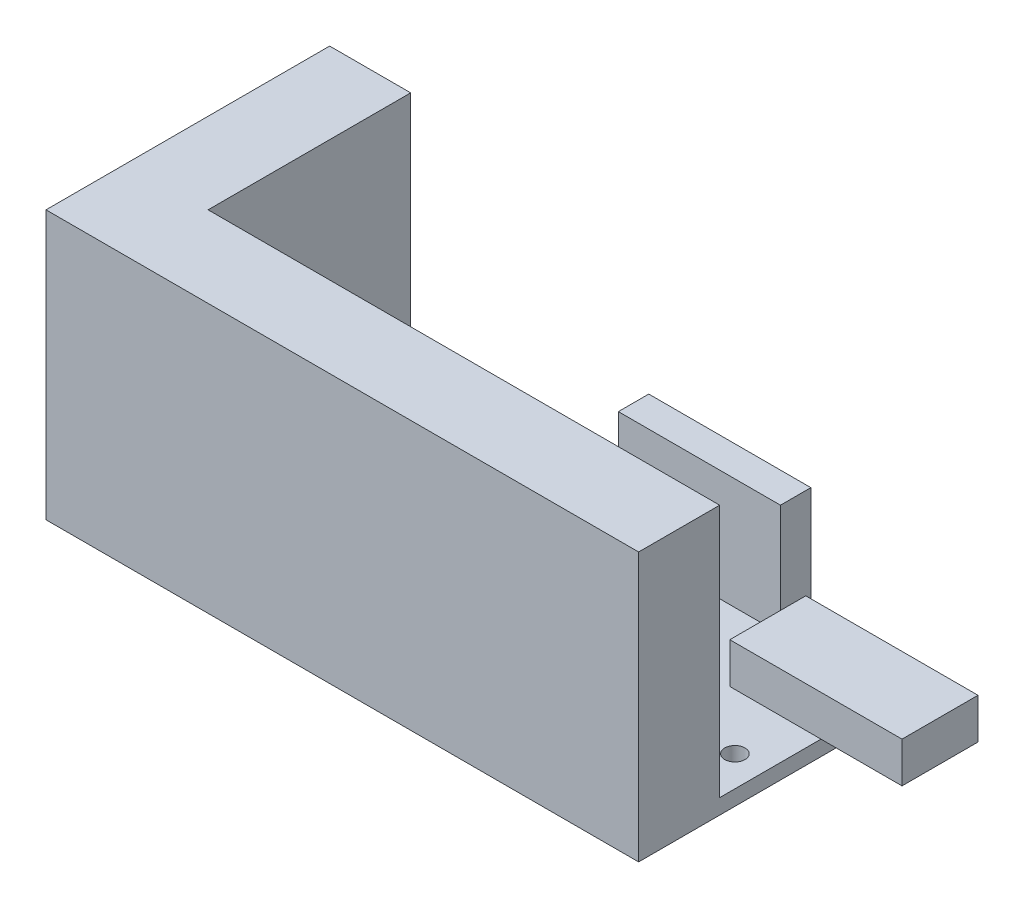
ISO-10303-21;
HEADER;
FILE_DESCRIPTION(('STEP AP214'),'2;1');
FILE_NAME('part.step','',(''),(''),'','','');
FILE_SCHEMA(('AUTOMOTIVE_DESIGN { 1 0 10303 214 1 1 1 1 }'));
ENDSEC;
DATA;
#1=APPLICATION_CONTEXT('core data for automotive mechanical design processes');
#2=APPLICATION_PROTOCOL_DEFINITION('international standard','automotive_design',2000,#1);
#3=PRODUCT_CONTEXT('',#1,'mechanical');
#4=PRODUCT('Part','Part','',(#3));
#5=PRODUCT_RELATED_PRODUCT_CATEGORY('part','',(#4));
#6=PRODUCT_DEFINITION_FORMATION('','',#4);
#7=PRODUCT_DEFINITION_CONTEXT('part definition',#1,'design');
#8=PRODUCT_DEFINITION('design','',#6,#7);
#9=PRODUCT_DEFINITION_SHAPE('','',#8);
#10=(LENGTH_UNIT() NAMED_UNIT(*) SI_UNIT(.MILLI.,.METRE.));
#11=(NAMED_UNIT(*) PLANE_ANGLE_UNIT() SI_UNIT($,.RADIAN.));
#12=(NAMED_UNIT(*) SI_UNIT($,.STERADIAN.) SOLID_ANGLE_UNIT());
#13=UNCERTAINTY_MEASURE_WITH_UNIT(LENGTH_MEASURE(1.E-05),#10,'distance_accuracy_value','');
#14=(GEOMETRIC_REPRESENTATION_CONTEXT(3) GLOBAL_UNCERTAINTY_ASSIGNED_CONTEXT((#13)) GLOBAL_UNIT_ASSIGNED_CONTEXT((#10,
#11,#12)) REPRESENTATION_CONTEXT('',''));
#15=CARTESIAN_POINT('',(0.,0.,0.));
#16=DIRECTION('',(0.,0.,1.));
#17=DIRECTION('',(1.,0.,0.));
#18=AXIS2_PLACEMENT_3D('',#15,#16,#17);
#19=CARTESIAN_POINT('',(0.,1.5,0.));
#20=DIRECTION('',(0.,-1.,0.));
#21=DIRECTION('',(0.,0.,-1.));
#22=AXIS2_PLACEMENT_3D('',#19,#20,#21);
#23=PLANE('',#22);
#24=DIRECTION('',(0.,0.,-1.));
#25=VECTOR('',#24,1.);
#26=CARTESIAN_POINT('',(0.,1.5,-28.));
#27=LINE('',#26,#25);
#28=CARTESIAN_POINT('',(0.,1.5,-8.));
#29=VERTEX_POINT('',#28);
#30=CARTESIAN_POINT('',(0.,1.5,-18.));
#31=VERTEX_POINT('',#30);
#32=EDGE_CURVE('E261',#29,#31,#27,.T.);
#33=ORIENTED_EDGE('',*,*,#32,.T.);
#34=DIRECTION('',(-1.,0.,0.));
#35=VECTOR('',#34,1.);
#36=CARTESIAN_POINT('',(0.,1.5,-18.));
#37=LINE('',#36,#35);
#38=CARTESIAN_POINT('',(-9.,1.5,-18.));
#39=VERTEX_POINT('',#38);
#40=EDGE_CURVE('E61',#31,#39,#37,.T.);
#41=ORIENTED_EDGE('',*,*,#40,.T.);
#42=DIRECTION('',(0.,0.,-1.));
#43=VECTOR('',#42,1.);
#44=CARTESIAN_POINT('',(-9.,1.5,0.));
#45=LINE('',#44,#43);
#46=CARTESIAN_POINT('',(-9.,1.5,-25.5));
#47=VERTEX_POINT('',#46);
#48=EDGE_CURVE('E56',#39,#47,#45,.T.);
#49=ORIENTED_EDGE('',*,*,#48,.T.);
#50=DIRECTION('',(1.,0.,0.));
#51=VECTOR('',#50,1.);
#52=CARTESIAN_POINT('',(0.,1.5,-25.5));
#53=LINE('',#52,#51);
#54=CARTESIAN_POINT('',(0.,1.5,-25.5));
#55=VERTEX_POINT('',#54);
#56=EDGE_CURVE('E190',#47,#55,#53,.T.);
#57=ORIENTED_EDGE('',*,*,#56,.T.);
#58=CARTESIAN_POINT('',(0.,1.5,-28.));
#59=VERTEX_POINT('',#58);
#60=EDGE_CURVE('E42',#55,#59,#27,.T.);
#61=ORIENTED_EDGE('',*,*,#60,.T.);
#62=DIRECTION('',(-1.,0.,0.));
#63=VECTOR('',#62,1.);
#64=CARTESIAN_POINT('',(-58.5,1.5,-28.));
#65=LINE('',#64,#63);
#66=CARTESIAN_POINT('',(-11.,1.5,-28.));
#67=VERTEX_POINT('',#66);
#68=EDGE_CURVE('E260',#59,#67,#65,.T.);
#69=ORIENTED_EDGE('',*,*,#68,.T.);
#70=DIRECTION('',(0.,0.,1.));
#71=VECTOR('',#70,1.);
#72=CARTESIAN_POINT('',(-11.,1.5,0.));
#73=LINE('',#72,#71);
#74=CARTESIAN_POINT('',(-11.,1.5,-25.));
#75=VERTEX_POINT('',#74);
#76=EDGE_CURVE('E201',#67,#75,#73,.T.);
#77=ORIENTED_EDGE('',*,*,#76,.T.);
#78=DIRECTION('',(-1.,0.,0.));
#79=VECTOR('',#78,1.);
#80=CARTESIAN_POINT('',(0.,1.5,-25.));
#81=LINE('',#80,#79);
#82=CARTESIAN_POINT('',(-27.,1.5,-25.));
#83=VERTEX_POINT('',#82);
#84=EDGE_CURVE('E212',#75,#83,#81,.T.);
#85=ORIENTED_EDGE('',*,*,#84,.T.);
#86=DIRECTION('',(0.,0.,-1.));
#87=VECTOR('',#86,1.);
#88=CARTESIAN_POINT('',(-27.,1.5,0.));
#89=LINE('',#88,#87);
#90=CARTESIAN_POINT('',(-27.,1.5,-28.));
#91=VERTEX_POINT('',#90);
#92=EDGE_CURVE('E166',#83,#91,#89,.T.);
#93=ORIENTED_EDGE('',*,*,#92,.T.);
#94=CARTESIAN_POINT('',(-50.5,1.5,-28.));
#95=VERTEX_POINT('',#94);
#96=EDGE_CURVE('E258',#91,#95,#65,.T.);
#97=ORIENTED_EDGE('',*,*,#96,.T.);
#98=DIRECTION('',(0.,0.,-1.));
#99=VECTOR('',#98,1.);
#100=CARTESIAN_POINT('',(-50.5,1.5,-28.));
#101=LINE('',#100,#99);
#102=CARTESIAN_POINT('',(-50.5,1.5,-8.));
#103=VERTEX_POINT('',#102);
#104=EDGE_CURVE('E231',#103,#95,#101,.T.);
#105=ORIENTED_EDGE('',*,*,#104,.F.);
#106=DIRECTION('',(-1.,0.,0.));
#107=VECTOR('',#106,1.);
#108=CARTESIAN_POINT('',(0.,1.5,-8.));
#109=LINE('',#108,#107);
#110=EDGE_CURVE('E226',#29,#103,#109,.T.);
#111=ORIENTED_EDGE('',*,*,#110,.F.);
#112=EDGE_LOOP('',(#33,#41,#49,#57,#61,#69,#77,#85,#93,#97,#105,#111));
#113=FACE_BOUND('',#112,.T.);
#114=CARTESIAN_POINT('',(-3.,1.5,-12.5));
#115=DIRECTION('',(0.,1.,0.));
#116=DIRECTION('',(0.,0.,1.));
#117=AXIS2_PLACEMENT_3D('',#114,#115,#116);
#118=CIRCLE('',#117,1.);
#119=CARTESIAN_POINT('',(-3.,1.5,-11.5));
#120=VERTEX_POINT('',#119);
#121=EDGE_CURVE('E328',#120,#120,#118,.T.);
#122=ORIENTED_EDGE('',*,*,#121,.F.);
#123=EDGE_LOOP('',(#122));
#124=FACE_BOUND('',#123,.T.);
#125=CARTESIAN_POINT('',(-41.5,1.5,-25.5));
#126=DIRECTION('',(0.,1.,0.));
#127=DIRECTION('',(0.,0.,1.));
#128=AXIS2_PLACEMENT_3D('',#125,#126,#127);
#129=CIRCLE('',#128,0.999999999999998);
#130=CARTESIAN_POINT('',(-41.5,1.5,-24.5));
#131=VERTEX_POINT('',#130);
#132=EDGE_CURVE('E279',#131,#131,#129,.T.);
#133=ORIENTED_EDGE('',*,*,#132,.F.);
#134=EDGE_LOOP('',(#133));
#135=FACE_BOUND('',#134,.T.);
#136=ADVANCED_FACE('F38',(#113,#124,#135),#23,.F.);
#137=CARTESIAN_POINT('',(0.,1.5,-28.));
#138=DIRECTION('',(-1.,0.,0.));
#139=DIRECTION('',(0.,0.,1.));
#140=AXIS2_PLACEMENT_3D('',#137,#138,#139);
#141=PLANE('',#140);
#142=DIRECTION('',(0.,0.,-1.));
#143=VECTOR('',#142,1.);
#144=CARTESIAN_POINT('',(0.,0.,-28.));
#145=LINE('',#144,#143);
#146=CARTESIAN_POINT('',(0.,0.,0.));
#147=VERTEX_POINT('',#146);
#148=CARTESIAN_POINT('',(0.,0.,-28.));
#149=VERTEX_POINT('',#148);
#150=EDGE_CURVE('E267',#147,#149,#145,.T.);
#151=ORIENTED_EDGE('',*,*,#150,.T.);
#152=DIRECTION('',(0.,-1.,0.));
#153=VECTOR('',#152,1.);
#154=CARTESIAN_POINT('',(0.,1.5,-28.));
#155=LINE('',#154,#153);
#156=EDGE_CURVE('E11',#59,#149,#155,.T.);
#157=ORIENTED_EDGE('',*,*,#156,.F.);
#158=ORIENTED_EDGE('',*,*,#60,.F.);
#159=EDGE_CURVE('E262',#31,#55,#27,.T.);
#160=ORIENTED_EDGE('',*,*,#159,.F.);
#161=ORIENTED_EDGE('',*,*,#32,.F.);
#162=DIRECTION('',(0.,-1.,0.));
#163=VECTOR('',#162,1.);
#164=CARTESIAN_POINT('',(0.,26.5,-8.));
#165=LINE('',#164,#163);
#166=CARTESIAN_POINT('',(0.,26.5,-8.));
#167=VERTEX_POINT('',#166);
#168=EDGE_CURVE('E277',#167,#29,#165,.T.);
#169=ORIENTED_EDGE('',*,*,#168,.F.);
#170=DIRECTION('',(0.,0.,-1.));
#171=VECTOR('',#170,1.);
#172=CARTESIAN_POINT('',(0.,26.5,0.));
#173=LINE('',#172,#171);
#174=CARTESIAN_POINT('',(0.,26.5,0.));
#175=VERTEX_POINT('',#174);
#176=EDGE_CURVE('E230',#175,#167,#173,.T.);
#177=ORIENTED_EDGE('',*,*,#176,.F.);
#178=DIRECTION('',(0.,-1.,0.));
#179=VECTOR('',#178,1.);
#180=CARTESIAN_POINT('',(0.,1.5,0.));
#181=LINE('',#180,#179);
#182=EDGE_CURVE('E273',#175,#147,#181,.T.);
#183=ORIENTED_EDGE('',*,*,#182,.T.);
#184=EDGE_LOOP('',(#151,#157,#158,#160,#161,#169,#177,#183));
#185=FACE_BOUND('',#184,.T.);
#186=ADVANCED_FACE('F40',(#185),#141,.F.);
#187=CARTESIAN_POINT('',(-58.5,1.5,-28.));
#188=DIRECTION('',(0.,0.,1.));
#189=DIRECTION('',(1.,0.,0.));
#190=AXIS2_PLACEMENT_3D('',#187,#188,#189);
#191=PLANE('',#190);
#192=DIRECTION('',(-1.,0.,0.));
#193=VECTOR('',#192,1.);
#194=CARTESIAN_POINT('',(-58.5,0.,-28.));
#195=LINE('',#194,#193);
#196=CARTESIAN_POINT('',(-58.5,0.,-28.));
#197=VERTEX_POINT('',#196);
#198=EDGE_CURVE('E309',#149,#197,#195,.T.);
#199=ORIENTED_EDGE('',*,*,#198,.T.);
#200=DIRECTION('',(0.,-1.,0.));
#201=VECTOR('',#200,1.);
#202=CARTESIAN_POINT('',(-58.5,1.5,-28.));
#203=LINE('',#202,#201);
#204=CARTESIAN_POINT('',(-58.5,26.5,-28.));
#205=VERTEX_POINT('',#204);
#206=EDGE_CURVE('E48',#205,#197,#203,.T.);
#207=ORIENTED_EDGE('',*,*,#206,.F.);
#208=DIRECTION('',(-1.,0.,0.));
#209=VECTOR('',#208,1.);
#210=CARTESIAN_POINT('',(-58.5,26.5,-28.));
#211=LINE('',#210,#209);
#212=CARTESIAN_POINT('',(-50.5,26.5,-28.));
#213=VERTEX_POINT('',#212);
#214=EDGE_CURVE('E237',#213,#205,#211,.T.);
#215=ORIENTED_EDGE('',*,*,#214,.F.);
#216=DIRECTION('',(0.,-1.,0.));
#217=VECTOR('',#216,1.);
#218=CARTESIAN_POINT('',(-50.5,26.5,-28.));
#219=LINE('',#218,#217);
#220=EDGE_CURVE('E243',#213,#95,#219,.T.);
#221=ORIENTED_EDGE('',*,*,#220,.T.);
#222=ORIENTED_EDGE('',*,*,#96,.F.);
#223=DIRECTION('',(0.,-1.,0.));
#224=VECTOR('',#223,1.);
#225=CARTESIAN_POINT('',(-27.,12.5,-28.));
#226=LINE('',#225,#224);
#227=CARTESIAN_POINT('',(-27.,12.5,-28.));
#228=VERTEX_POINT('',#227);
#229=EDGE_CURVE('E209',#228,#91,#226,.T.);
#230=ORIENTED_EDGE('',*,*,#229,.F.);
#231=DIRECTION('',(-1.,0.,0.));
#232=VECTOR('',#231,1.);
#233=CARTESIAN_POINT('',(0.,12.5,-28.));
#234=LINE('',#233,#232);
#235=CARTESIAN_POINT('',(-11.,12.5,-28.));
#236=VERTEX_POINT('',#235);
#237=EDGE_CURVE('E207',#236,#228,#234,.T.);
#238=ORIENTED_EDGE('',*,*,#237,.F.);
#239=DIRECTION('',(0.,-1.,0.));
#240=VECTOR('',#239,1.);
#241=CARTESIAN_POINT('',(-11.,12.5,-28.));
#242=LINE('',#241,#240);
#243=EDGE_CURVE('E217',#236,#67,#242,.T.);
#244=ORIENTED_EDGE('',*,*,#243,.T.);
#245=ORIENTED_EDGE('',*,*,#68,.F.);
#246=ORIENTED_EDGE('',*,*,#156,.T.);
#247=EDGE_LOOP('',(#199,#207,#215,#221,#222,#230,#238,#244,#245,#246));
#248=FACE_BOUND('',#247,.T.);
#249=ADVANCED_FACE('F349',(#248),#191,.F.);
#250=CARTESIAN_POINT('',(-58.5,1.5,0.));
#251=DIRECTION('',(1.,0.,0.));
#252=DIRECTION('',(0.,0.,-1.));
#253=AXIS2_PLACEMENT_3D('',#250,#251,#252);
#254=PLANE('',#253);
#255=DIRECTION('',(0.,0.,1.));
#256=VECTOR('',#255,1.);
#257=CARTESIAN_POINT('',(-58.5,0.,0.));
#258=LINE('',#257,#256);
#259=CARTESIAN_POINT('',(-58.5,0.,0.));
#260=VERTEX_POINT('',#259);
#261=EDGE_CURVE('E303',#197,#260,#258,.T.);
#262=ORIENTED_EDGE('',*,*,#261,.T.);
#263=DIRECTION('',(0.,-1.,0.));
#264=VECTOR('',#263,1.);
#265=CARTESIAN_POINT('',(-58.5,1.5,0.));
#266=LINE('',#265,#264);
#267=CARTESIAN_POINT('',(-58.5,26.5,0.));
#268=VERTEX_POINT('',#267);
#269=EDGE_CURVE('E313',#268,#260,#266,.T.);
#270=ORIENTED_EDGE('',*,*,#269,.F.);
#271=DIRECTION('',(0.,0.,1.));
#272=VECTOR('',#271,1.);
#273=CARTESIAN_POINT('',(-58.5,26.5,0.));
#274=LINE('',#273,#272);
#275=EDGE_CURVE('E240',#205,#268,#274,.T.);
#276=ORIENTED_EDGE('',*,*,#275,.F.);
#277=ORIENTED_EDGE('',*,*,#206,.T.);
#278=EDGE_LOOP('',(#262,#270,#276,#277));
#279=FACE_BOUND('',#278,.T.);
#280=ADVANCED_FACE('F319',(#279),#254,.F.);
#281=CARTESIAN_POINT('',(0.,1.5,0.));
#282=DIRECTION('',(0.,0.,-1.));
#283=DIRECTION('',(-1.,0.,0.));
#284=AXIS2_PLACEMENT_3D('',#281,#282,#283);
#285=PLANE('',#284);
#286=DIRECTION('',(1.,0.,0.));
#287=VECTOR('',#286,1.);
#288=CARTESIAN_POINT('',(0.,0.,0.));
#289=LINE('',#288,#287);
#290=EDGE_CURVE('E301',#260,#147,#289,.T.);
#291=ORIENTED_EDGE('',*,*,#290,.T.);
#292=ORIENTED_EDGE('',*,*,#182,.F.);
#293=DIRECTION('',(1.,0.,0.));
#294=VECTOR('',#293,1.);
#295=CARTESIAN_POINT('',(-58.5,26.5,0.));
#296=LINE('',#295,#294);
#297=EDGE_CURVE('E227',#268,#175,#296,.T.);
#298=ORIENTED_EDGE('',*,*,#297,.F.);
#299=ORIENTED_EDGE('',*,*,#269,.T.);
#300=EDGE_LOOP('',(#291,#292,#298,#299));
#301=FACE_BOUND('',#300,.T.);
#302=ADVANCED_FACE('F354',(#301),#285,.F.);
#303=CARTESIAN_POINT('',(0.,0.,0.));
#304=DIRECTION('',(0.,-1.,0.));
#305=DIRECTION('',(0.,0.,-1.));
#306=AXIS2_PLACEMENT_3D('',#303,#304,#305);
#307=PLANE('',#306);
#308=CARTESIAN_POINT('',(-41.5,0.,-25.5));
#309=DIRECTION('',(0.,1.,0.));
#310=DIRECTION('',(0.,0.,1.));
#311=AXIS2_PLACEMENT_3D('',#308,#309,#310);
#312=CIRCLE('',#311,0.999999999999998);
#313=CARTESIAN_POINT('',(-41.5,0.,-24.5));
#314=VERTEX_POINT('',#313);
#315=EDGE_CURVE('E284',#314,#314,#312,.T.);
#316=ORIENTED_EDGE('',*,*,#315,.T.);
#317=EDGE_LOOP('',(#316));
#318=FACE_BOUND('',#317,.T.);
#319=CARTESIAN_POINT('',(-3.,0.,-12.5));
#320=DIRECTION('',(0.,1.,0.));
#321=DIRECTION('',(0.,0.,1.));
#322=AXIS2_PLACEMENT_3D('',#319,#320,#321);
#323=CIRCLE('',#322,1.);
#324=CARTESIAN_POINT('',(-3.,0.,-11.5));
#325=VERTEX_POINT('',#324);
#326=EDGE_CURVE('E326',#325,#325,#323,.T.);
#327=ORIENTED_EDGE('',*,*,#326,.T.);
#328=EDGE_LOOP('',(#327));
#329=FACE_BOUND('',#328,.T.);
#330=ORIENTED_EDGE('',*,*,#150,.F.);
#331=ORIENTED_EDGE('',*,*,#290,.F.);
#332=ORIENTED_EDGE('',*,*,#261,.F.);
#333=ORIENTED_EDGE('',*,*,#198,.F.);
#334=EDGE_LOOP('',(#330,#331,#332,#333));
#335=FACE_BOUND('',#334,.T.);
#336=ADVANCED_FACE('F324',(#318,#329,#335),#307,.T.);
#337=CARTESIAN_POINT('',(-3.,0.,-12.5));
#338=DIRECTION('',(0.,1.,0.));
#339=DIRECTION('',(0.,0.,1.));
#340=AXIS2_PLACEMENT_3D('',#337,#338,#339);
#341=CYLINDRICAL_SURFACE('',#340,1.);
#342=ORIENTED_EDGE('',*,*,#326,.F.);
#343=EDGE_LOOP('',(#342));
#344=FACE_BOUND('',#343,.T.);
#345=ORIENTED_EDGE('',*,*,#121,.T.);
#346=EDGE_LOOP('',(#345));
#347=FACE_BOUND('',#346,.T.);
#348=ADVANCED_FACE('F340',(#344,#347),#341,.F.);
#349=CARTESIAN_POINT('',(-41.5,0.,-25.5));
#350=DIRECTION('',(0.,1.,0.));
#351=DIRECTION('',(0.,0.,1.));
#352=AXIS2_PLACEMENT_3D('',#349,#350,#351);
#353=CYLINDRICAL_SURFACE('',#352,0.999999999999998);
#354=ORIENTED_EDGE('',*,*,#315,.F.);
#355=EDGE_LOOP('',(#354));
#356=FACE_BOUND('',#355,.T.);
#357=ORIENTED_EDGE('',*,*,#132,.T.);
#358=EDGE_LOOP('',(#357));
#359=FACE_BOUND('',#358,.T.);
#360=ADVANCED_FACE('F337',(#356,#359),#353,.F.);
#361=CARTESIAN_POINT('',(0.,26.5,-8.));
#362=DIRECTION('',(0.,0.,1.));
#363=DIRECTION('',(1.,0.,0.));
#364=AXIS2_PLACEMENT_3D('',#361,#362,#363);
#365=PLANE('',#364);
#366=ORIENTED_EDGE('',*,*,#110,.T.);
#367=DIRECTION('',(0.,-1.,0.));
#368=VECTOR('',#367,1.);
#369=CARTESIAN_POINT('',(-50.5,26.5,-8.));
#370=LINE('',#369,#368);
#371=CARTESIAN_POINT('',(-50.5,26.5,-8.));
#372=VERTEX_POINT('',#371);
#373=EDGE_CURVE('E246',#372,#103,#370,.T.);
#374=ORIENTED_EDGE('',*,*,#373,.F.);
#375=DIRECTION('',(-1.,0.,0.));
#376=VECTOR('',#375,1.);
#377=CARTESIAN_POINT('',(0.,26.5,-8.));
#378=LINE('',#377,#376);
#379=EDGE_CURVE('E233',#167,#372,#378,.T.);
#380=ORIENTED_EDGE('',*,*,#379,.F.);
#381=ORIENTED_EDGE('',*,*,#168,.T.);
#382=EDGE_LOOP('',(#366,#374,#380,#381));
#383=FACE_BOUND('',#382,.T.);
#384=ADVANCED_FACE('F292',(#383),#365,.F.);
#385=CARTESIAN_POINT('',(-50.5,26.5,-28.));
#386=DIRECTION('',(-1.,0.,0.));
#387=DIRECTION('',(0.,0.,1.));
#388=AXIS2_PLACEMENT_3D('',#385,#386,#387);
#389=PLANE('',#388);
#390=ORIENTED_EDGE('',*,*,#104,.T.);
#391=ORIENTED_EDGE('',*,*,#220,.F.);
#392=DIRECTION('',(0.,0.,-1.));
#393=VECTOR('',#392,1.);
#394=CARTESIAN_POINT('',(-50.5,26.5,-28.));
#395=LINE('',#394,#393);
#396=EDGE_CURVE('E235',#372,#213,#395,.T.);
#397=ORIENTED_EDGE('',*,*,#396,.F.);
#398=ORIENTED_EDGE('',*,*,#373,.T.);
#399=EDGE_LOOP('',(#390,#391,#397,#398));
#400=FACE_BOUND('',#399,.T.);
#401=ADVANCED_FACE('F290',(#400),#389,.F.);
#402=CARTESIAN_POINT('',(0.,26.5,0.));
#403=DIRECTION('',(0.,1.,0.));
#404=DIRECTION('',(0.,0.,1.));
#405=AXIS2_PLACEMENT_3D('',#402,#403,#404);
#406=PLANE('',#405);
#407=ORIENTED_EDGE('',*,*,#297,.T.);
#408=ORIENTED_EDGE('',*,*,#176,.T.);
#409=ORIENTED_EDGE('',*,*,#379,.T.);
#410=ORIENTED_EDGE('',*,*,#396,.T.);
#411=ORIENTED_EDGE('',*,*,#214,.T.);
#412=ORIENTED_EDGE('',*,*,#275,.T.);
#413=EDGE_LOOP('',(#407,#408,#409,#410,#411,#412));
#414=FACE_BOUND('',#413,.T.);
#415=ADVANCED_FACE('F396',(#414),#406,.T.);
#416=CARTESIAN_POINT('',(-27.,12.5,0.));
#417=DIRECTION('',(-1.,0.,0.));
#418=DIRECTION('',(0.,0.,1.));
#419=AXIS2_PLACEMENT_3D('',#416,#417,#418);
#420=PLANE('',#419);
#421=ORIENTED_EDGE('',*,*,#92,.F.);
#422=DIRECTION('',(0.,-1.,0.));
#423=VECTOR('',#422,1.);
#424=CARTESIAN_POINT('',(-27.,12.5,-25.));
#425=LINE('',#424,#423);
#426=CARTESIAN_POINT('',(-27.,12.5,-25.));
#427=VERTEX_POINT('',#426);
#428=EDGE_CURVE('E223',#427,#83,#425,.T.);
#429=ORIENTED_EDGE('',*,*,#428,.F.);
#430=DIRECTION('',(0.,0.,-1.));
#431=VECTOR('',#430,1.);
#432=CARTESIAN_POINT('',(-27.,12.5,0.));
#433=LINE('',#432,#431);
#434=EDGE_CURVE('E197',#427,#228,#433,.T.);
#435=ORIENTED_EDGE('',*,*,#434,.T.);
#436=ORIENTED_EDGE('',*,*,#229,.T.);
#437=EDGE_LOOP('',(#421,#429,#435,#436));
#438=FACE_BOUND('',#437,.T.);
#439=ADVANCED_FACE('F392',(#438),#420,.T.);
#440=CARTESIAN_POINT('',(0.,12.5,-25.));
#441=DIRECTION('',(0.,0.,1.));
#442=DIRECTION('',(1.,0.,0.));
#443=AXIS2_PLACEMENT_3D('',#440,#441,#442);
#444=PLANE('',#443);
#445=ORIENTED_EDGE('',*,*,#84,.F.);
#446=DIRECTION('',(0.,-1.,0.));
#447=VECTOR('',#446,1.);
#448=CARTESIAN_POINT('',(-11.,12.5,-25.));
#449=LINE('',#448,#447);
#450=CARTESIAN_POINT('',(-11.,12.5,-25.));
#451=VERTEX_POINT('',#450);
#452=EDGE_CURVE('E220',#451,#75,#449,.T.);
#453=ORIENTED_EDGE('',*,*,#452,.F.);
#454=DIRECTION('',(-1.,0.,0.));
#455=VECTOR('',#454,1.);
#456=CARTESIAN_POINT('',(0.,12.5,-25.));
#457=LINE('',#456,#455);
#458=EDGE_CURVE('E200',#451,#427,#457,.T.);
#459=ORIENTED_EDGE('',*,*,#458,.T.);
#460=ORIENTED_EDGE('',*,*,#428,.T.);
#461=EDGE_LOOP('',(#445,#453,#459,#460));
#462=FACE_BOUND('',#461,.T.);
#463=ADVANCED_FACE('F388',(#462),#444,.T.);
#464=CARTESIAN_POINT('',(-11.,12.5,0.));
#465=DIRECTION('',(1.,0.,0.));
#466=DIRECTION('',(0.,0.,-1.));
#467=AXIS2_PLACEMENT_3D('',#464,#465,#466);
#468=PLANE('',#467);
#469=ORIENTED_EDGE('',*,*,#76,.F.);
#470=ORIENTED_EDGE('',*,*,#243,.F.);
#471=DIRECTION('',(0.,0.,1.));
#472=VECTOR('',#471,1.);
#473=CARTESIAN_POINT('',(-11.,12.5,0.));
#474=LINE('',#473,#472);
#475=EDGE_CURVE('E204',#236,#451,#474,.T.);
#476=ORIENTED_EDGE('',*,*,#475,.T.);
#477=ORIENTED_EDGE('',*,*,#452,.T.);
#478=EDGE_LOOP('',(#469,#470,#476,#477));
#479=FACE_BOUND('',#478,.T.);
#480=ADVANCED_FACE('F373',(#479),#468,.T.);
#481=CARTESIAN_POINT('',(0.,12.5,0.));
#482=DIRECTION('',(0.,1.,0.));
#483=DIRECTION('',(0.,0.,1.));
#484=AXIS2_PLACEMENT_3D('',#481,#482,#483);
#485=PLANE('',#484);
#486=ORIENTED_EDGE('',*,*,#434,.F.);
#487=ORIENTED_EDGE('',*,*,#458,.F.);
#488=ORIENTED_EDGE('',*,*,#475,.F.);
#489=ORIENTED_EDGE('',*,*,#237,.T.);
#490=EDGE_LOOP('',(#486,#487,#488,#489));
#491=FACE_BOUND('',#490,.T.);
#492=ADVANCED_FACE('F366',(#491),#485,.T.);
#493=CARTESIAN_POINT('',(0.,1.5,0.));
#494=DIRECTION('',(0.,1.,0.));
#495=DIRECTION('',(0.,0.,1.));
#496=AXIS2_PLACEMENT_3D('',#493,#494,#495);
#497=PLANE('',#496);
#498=CARTESIAN_POINT('',(8.,1.5,-18.));
#499=VERTEX_POINT('',#498);
#500=EDGE_CURVE('E161',#499,#31,#37,.T.);
#501=ORIENTED_EDGE('',*,*,#500,.T.);
#502=ORIENTED_EDGE('',*,*,#159,.T.);
#503=CARTESIAN_POINT('',(8.,1.5,-25.5));
#504=VERTEX_POINT('',#503);
#505=EDGE_CURVE('E189',#55,#504,#53,.T.);
#506=ORIENTED_EDGE('',*,*,#505,.T.);
#507=DIRECTION('',(0.,0.,1.));
#508=VECTOR('',#507,1.);
#509=CARTESIAN_POINT('',(8.,1.5,0.));
#510=LINE('',#509,#508);
#511=EDGE_CURVE('E187',#504,#499,#510,.T.);
#512=ORIENTED_EDGE('',*,*,#511,.T.);
#513=EDGE_LOOP('',(#501,#502,#506,#512));
#514=FACE_BOUND('',#513,.T.);
#515=ADVANCED_FACE('F364',(#514),#497,.F.);
#516=CARTESIAN_POINT('',(0.,5.5,-18.));
#517=DIRECTION('',(0.,0.,1.));
#518=DIRECTION('',(1.,0.,0.));
#519=AXIS2_PLACEMENT_3D('',#516,#517,#518);
#520=PLANE('',#519);
#521=ORIENTED_EDGE('',*,*,#500,.F.);
#522=DIRECTION('',(0.,-1.,0.));
#523=VECTOR('',#522,1.);
#524=CARTESIAN_POINT('',(8.,5.5,-18.));
#525=LINE('',#524,#523);
#526=CARTESIAN_POINT('',(8.,5.5,-18.));
#527=VERTEX_POINT('',#526);
#528=EDGE_CURVE('E155',#527,#499,#525,.T.);
#529=ORIENTED_EDGE('',*,*,#528,.F.);
#530=DIRECTION('',(-1.,0.,0.));
#531=VECTOR('',#530,1.);
#532=CARTESIAN_POINT('',(0.,5.5,-18.));
#533=LINE('',#532,#531);
#534=CARTESIAN_POINT('',(-9.,5.5,-18.));
#535=VERTEX_POINT('',#534);
#536=EDGE_CURVE('E158',#527,#535,#533,.T.);
#537=ORIENTED_EDGE('',*,*,#536,.T.);
#538=DIRECTION('',(0.,-1.,0.));
#539=VECTOR('',#538,1.);
#540=CARTESIAN_POINT('',(-9.,5.5,-18.));
#541=LINE('',#540,#539);
#542=EDGE_CURVE('E185',#535,#39,#541,.T.);
#543=ORIENTED_EDGE('',*,*,#542,.T.);
#544=ORIENTED_EDGE('',*,*,#40,.F.);
#545=EDGE_LOOP('',(#521,#529,#537,#543,#544));
#546=FACE_BOUND('',#545,.T.);
#547=ADVANCED_FACE('F157',(#546),#520,.T.);
#548=CARTESIAN_POINT('',(8.,5.5,0.));
#549=DIRECTION('',(1.,0.,0.));
#550=DIRECTION('',(0.,0.,-1.));
#551=AXIS2_PLACEMENT_3D('',#548,#549,#550);
#552=PLANE('',#551);
#553=ORIENTED_EDGE('',*,*,#511,.F.);
#554=DIRECTION('',(0.,-1.,0.));
#555=VECTOR('',#554,1.);
#556=CARTESIAN_POINT('',(8.,5.5,-25.5));
#557=LINE('',#556,#555);
#558=CARTESIAN_POINT('',(8.,5.5,-25.5));
#559=VERTEX_POINT('',#558);
#560=EDGE_CURVE('E167',#559,#504,#557,.T.);
#561=ORIENTED_EDGE('',*,*,#560,.F.);
#562=DIRECTION('',(0.,0.,1.));
#563=VECTOR('',#562,1.);
#564=CARTESIAN_POINT('',(8.,5.5,0.));
#565=LINE('',#564,#563);
#566=EDGE_CURVE('E173',#559,#527,#565,.T.);
#567=ORIENTED_EDGE('',*,*,#566,.T.);
#568=ORIENTED_EDGE('',*,*,#528,.T.);
#569=EDGE_LOOP('',(#553,#561,#567,#568));
#570=FACE_BOUND('',#569,.T.);
#571=ADVANCED_FACE('F178',(#570),#552,.T.);
#572=CARTESIAN_POINT('',(0.,5.5,-25.5));
#573=DIRECTION('',(0.,0.,-1.));
#574=DIRECTION('',(-1.,0.,0.));
#575=AXIS2_PLACEMENT_3D('',#572,#573,#574);
#576=PLANE('',#575);
#577=ORIENTED_EDGE('',*,*,#56,.F.);
#578=DIRECTION('',(0.,-1.,0.));
#579=VECTOR('',#578,1.);
#580=CARTESIAN_POINT('',(-9.,5.5,-25.5));
#581=LINE('',#580,#579);
#582=CARTESIAN_POINT('',(-9.,5.5,-25.5));
#583=VERTEX_POINT('',#582);
#584=EDGE_CURVE('E194',#583,#47,#581,.T.);
#585=ORIENTED_EDGE('',*,*,#584,.F.);
#586=DIRECTION('',(1.,0.,0.));
#587=VECTOR('',#586,1.);
#588=CARTESIAN_POINT('',(0.,5.5,-25.5));
#589=LINE('',#588,#587);
#590=EDGE_CURVE('E180',#583,#559,#589,.T.);
#591=ORIENTED_EDGE('',*,*,#590,.T.);
#592=ORIENTED_EDGE('',*,*,#560,.T.);
#593=ORIENTED_EDGE('',*,*,#505,.F.);
#594=EDGE_LOOP('',(#577,#585,#591,#592,#593));
#595=FACE_BOUND('',#594,.T.);
#596=ADVANCED_FACE('F363',(#595),#576,.T.);
#597=CARTESIAN_POINT('',(-9.,5.5,0.));
#598=DIRECTION('',(-1.,0.,0.));
#599=DIRECTION('',(0.,0.,1.));
#600=AXIS2_PLACEMENT_3D('',#597,#598,#599);
#601=PLANE('',#600);
#602=ORIENTED_EDGE('',*,*,#48,.F.);
#603=ORIENTED_EDGE('',*,*,#542,.F.);
#604=DIRECTION('',(0.,0.,-1.));
#605=VECTOR('',#604,1.);
#606=CARTESIAN_POINT('',(-9.,5.5,0.));
#607=LINE('',#606,#605);
#608=EDGE_CURVE('E176',#535,#583,#607,.T.);
#609=ORIENTED_EDGE('',*,*,#608,.T.);
#610=ORIENTED_EDGE('',*,*,#584,.T.);
#611=EDGE_LOOP('',(#602,#603,#609,#610));
#612=FACE_BOUND('',#611,.T.);
#613=ADVANCED_FACE('F378',(#612),#601,.T.);
#614=CARTESIAN_POINT('',(0.,5.5,0.));
#615=DIRECTION('',(0.,1.,0.));
#616=DIRECTION('',(0.,0.,1.));
#617=AXIS2_PLACEMENT_3D('',#614,#615,#616);
#618=PLANE('',#617);
#619=ORIENTED_EDGE('',*,*,#536,.F.);
#620=ORIENTED_EDGE('',*,*,#566,.F.);
#621=ORIENTED_EDGE('',*,*,#590,.F.);
#622=ORIENTED_EDGE('',*,*,#608,.F.);
#623=EDGE_LOOP('',(#619,#620,#621,#622));
#624=FACE_BOUND('',#623,.T.);
#625=ADVANCED_FACE('F171',(#624),#618,.T.);
#626=CLOSED_SHELL('',(#136,#186,#249,#280,#302,#336,#348,#360,#384,#401,#415,#439,#463,#480,
#492,#515,#547,#571,#596,#613,#625));
#627=MANIFOLD_SOLID_BREP('B2',#626);
#628=ADVANCED_BREP_SHAPE_REPRESENTATION('',(#18,#627),#14);
#629=SHAPE_DEFINITION_REPRESENTATION(#9,#628);
ENDSEC;
END-ISO-10303-21;
